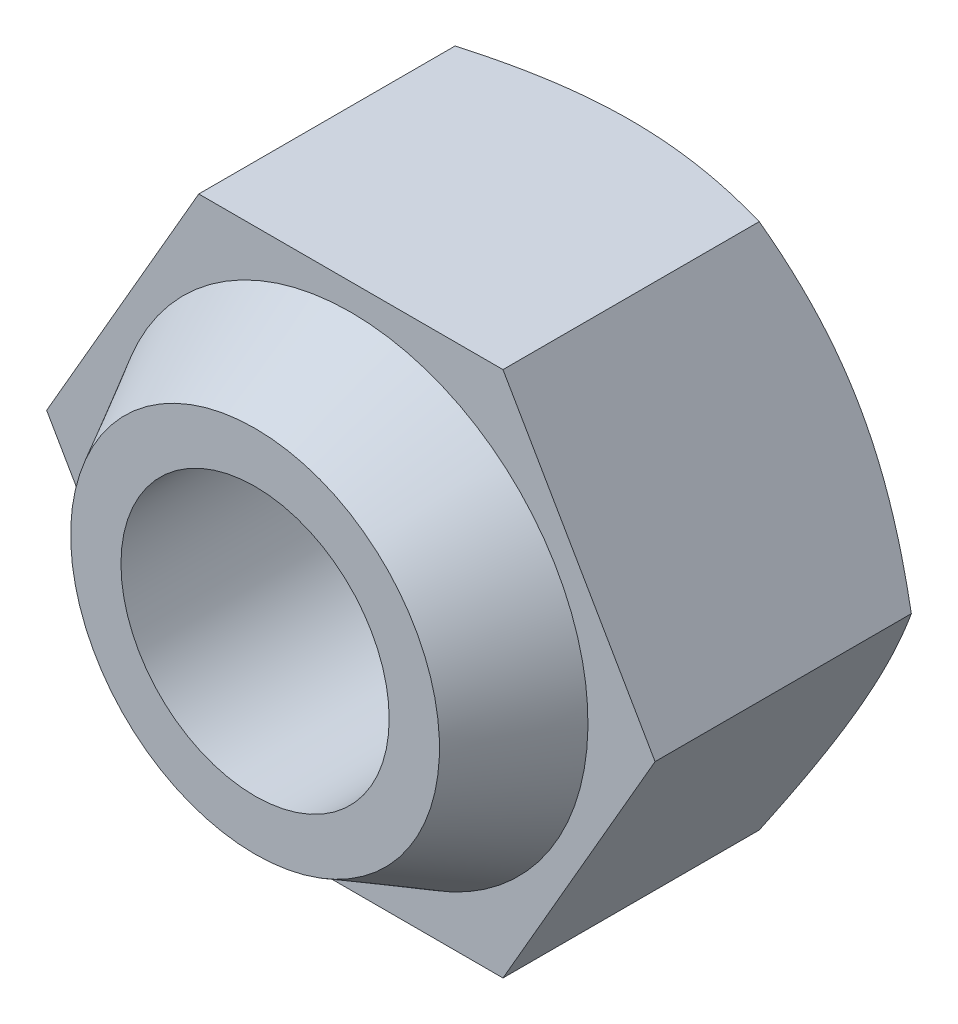
ISO-10303-21;
HEADER;
FILE_DESCRIPTION(('STEP AP214'),'2;1');
FILE_NAME('part.step','',(''),(''),'','','');
FILE_SCHEMA(('AUTOMOTIVE_DESIGN { 1 0 10303 214 1 1 1 1 }'));
ENDSEC;
DATA;
#1=APPLICATION_CONTEXT('core data for automotive mechanical design processes');
#2=APPLICATION_PROTOCOL_DEFINITION('international standard','automotive_design',2000,#1);
#3=PRODUCT_CONTEXT('',#1,'mechanical');
#4=PRODUCT('Part','Part','',(#3));
#5=PRODUCT_RELATED_PRODUCT_CATEGORY('part','',(#4));
#6=PRODUCT_DEFINITION_FORMATION('','',#4);
#7=PRODUCT_DEFINITION_CONTEXT('part definition',#1,'design');
#8=PRODUCT_DEFINITION('design','',#6,#7);
#9=PRODUCT_DEFINITION_SHAPE('','',#8);
#10=(LENGTH_UNIT() NAMED_UNIT(*) SI_UNIT(.MILLI.,.METRE.));
#11=(NAMED_UNIT(*) PLANE_ANGLE_UNIT() SI_UNIT($,.RADIAN.));
#12=(NAMED_UNIT(*) SI_UNIT($,.STERADIAN.) SOLID_ANGLE_UNIT());
#13=UNCERTAINTY_MEASURE_WITH_UNIT(LENGTH_MEASURE(1.E-05),#10,'distance_accuracy_value','');
#14=(GEOMETRIC_REPRESENTATION_CONTEXT(3) GLOBAL_UNCERTAINTY_ASSIGNED_CONTEXT((#13)) GLOBAL_UNIT_ASSIGNED_CONTEXT((#10,
#11,#12)) REPRESENTATION_CONTEXT('',''));
#15=CARTESIAN_POINT('',(0.,0.,0.));
#16=DIRECTION('',(0.,0.,1.));
#17=DIRECTION('',(1.,0.,0.));
#18=AXIS2_PLACEMENT_3D('',#15,#16,#17);
#19=CARTESIAN_POINT('',(1.58771324027147,-2.75,3.));
#20=DIRECTION('',(-0.866025403784439,0.5,0.));
#21=DIRECTION('',(-0.5,-0.866025403784439,0.));
#22=AXIS2_PLACEMENT_3D('',#19,#20,#21);
#23=PLANE('',#22);
#24=CARTESIAN_POINT('',(3.17554195059678,0.0002,0.325072425378332));
#25=CARTESIAN_POINT('',(3.10576962051743,-0.120649220659906,0.284773324262835));
#26=CARTESIAN_POINT('',(3.03539502097908,-0.242541602622634,0.248122564611234));
#27=CARTESIAN_POINT('',(2.89342717394439,-0.488437126727892,0.184147844983373));
#28=CARTESIAN_POINT('',(2.82183140359858,-0.612444638573855,0.15684651768807));
#29=CARTESIAN_POINT('',(2.67952717191842,-0.858922797975944,0.114347407307689));
#30=CARTESIAN_POINT('',(2.60884060771577,-0.981355518587417,0.0988667806360302));
#31=CARTESIAN_POINT('',(2.46713482015518,-1.22679714236892,0.080385059383513));
#32=CARTESIAN_POINT('',(2.39611611197038,-1.34980515323291,0.0773686614761725));
#33=CARTESIAN_POINT('',(2.26341005486544,-1.57965878661079,0.0836388074421195));
#34=CARTESIAN_POINT('',(2.20170285541369,-1.68653879125402,0.0913858162902751));
#35=CARTESIAN_POINT('',(2.07869048467395,-1.89960246733475,0.115940843077927));
#36=CARTESIAN_POINT('',(2.01738573896433,-2.00578540164889,0.132757251664143));
#37=CARTESIAN_POINT('',(1.89411967378235,-2.21928848939318,0.174797584359529));
#38=CARTESIAN_POINT('',(1.83217395817123,-2.32658161614285,0.200199742700803));
#39=CARTESIAN_POINT('',(1.70920651275307,-2.53956747928405,0.257852887853554));
#40=CARTESIAN_POINT('',(1.64818320715446,-2.64526294502665,0.290090325312555));
#41=CARTESIAN_POINT('',(1.58759777021763,-2.7502,0.325072425378332));
#42=B_SPLINE_CURVE_WITH_KNOTS('',3,(#24,#25,#26,#27,#28,#29,#30,#31,#32,#33,#34,#35,#36,#37,#38,
#39,#40,#41),.UNSPECIFIED.,.F.,.F.,(4,2,2,2,2,2,2,2,4),(0.,0.435912828725888,0.872873557116332,
1.29901931904672,1.72464171213574,2.09526089052938,2.46622354066374,2.84541551798557,
3.22386274754524),.UNSPECIFIED.);
#43=CARTESIAN_POINT('',(3.17542648054294,0.,0.325005755075434));
#44=VERTEX_POINT('',#43);
#45=CARTESIAN_POINT('',(1.58771324027147,-2.75,0.325005755075434));
#46=VERTEX_POINT('',#45);
#47=EDGE_CURVE('E59',#44,#46,#42,.T.);
#48=ORIENTED_EDGE('',*,*,#47,.F.);
#49=DIRECTION('',(0.,0.,-1.));
#50=VECTOR('',#49,1.);
#51=CARTESIAN_POINT('',(3.17542648054294,0.,3.));
#52=LINE('',#51,#50);
#53=CARTESIAN_POINT('',(3.17542648054294,0.,3.));
#54=VERTEX_POINT('',#53);
#55=EDGE_CURVE('E52',#54,#44,#52,.T.);
#56=ORIENTED_EDGE('',*,*,#55,.F.);
#57=DIRECTION('',(0.5,0.866025403784439,0.));
#58=VECTOR('',#57,1.);
#59=CARTESIAN_POINT('',(1.58771324027147,-2.75,3.));
#60=LINE('',#59,#58);
#61=CARTESIAN_POINT('',(1.58771324027147,-2.75,3.));
#62=VERTEX_POINT('',#61);
#63=EDGE_CURVE('E332',#62,#54,#60,.T.);
#64=ORIENTED_EDGE('',*,*,#63,.F.);
#65=DIRECTION('',(0.,0.,-1.));
#66=VECTOR('',#65,1.);
#67=CARTESIAN_POINT('',(1.58771324027147,-2.75,3.));
#68=LINE('',#67,#66);
#69=EDGE_CURVE('E110',#62,#46,#68,.T.);
#70=ORIENTED_EDGE('',*,*,#69,.T.);
#71=EDGE_LOOP('',(#48,#56,#64,#70));
#72=FACE_BOUND('',#71,.T.);
#73=ADVANCED_FACE('F43',(#72),#23,.F.);
#74=CARTESIAN_POINT('',(3.17542648054294,0.,3.));
#75=DIRECTION('',(-0.866025403784439,-0.5,0.));
#76=DIRECTION('',(0.,0.,1.));
#77=AXIS2_PLACEMENT_3D('',#74,#75,#76);
#78=PLANE('',#77);
#79=CARTESIAN_POINT('',(1.58759777021763,2.7502,0.325072425378332));
#80=CARTESIAN_POINT('',(1.65737010029699,2.62935077934009,0.284773324262835));
#81=CARTESIAN_POINT('',(1.72774469983533,2.50745839737737,0.248122564611234));
#82=CARTESIAN_POINT('',(1.86971254687003,2.26156287327211,0.184147844983373));
#83=CARTESIAN_POINT('',(1.94130831721583,2.13755536142614,0.15684651768807));
#84=CARTESIAN_POINT('',(2.08361254889599,1.89107720202406,0.11434740730769));
#85=CARTESIAN_POINT('',(2.15429911309864,1.76864448141258,0.0988667806360306));
#86=CARTESIAN_POINT('',(2.29600490065923,1.52320285763108,0.0803850593835131));
#87=CARTESIAN_POINT('',(2.36702360884404,1.40019484676709,0.0773686614761723));
#88=CARTESIAN_POINT('',(2.49972966594897,1.17034121338921,0.0836388074421193));
#89=CARTESIAN_POINT('',(2.56143686540073,1.06346120874598,0.0913858162902751));
#90=CARTESIAN_POINT('',(2.68444923614047,0.85039753266525,0.115940843077927));
#91=CARTESIAN_POINT('',(2.74575398185008,0.744214598351111,0.132757251664143));
#92=CARTESIAN_POINT('',(2.86902004703206,0.530711510606816,0.174797584359529));
#93=CARTESIAN_POINT('',(2.93096576264318,0.423418383857145,0.200199742700803));
#94=CARTESIAN_POINT('',(3.05393320806134,0.210432520715949,0.257852887853554));
#95=CARTESIAN_POINT('',(3.11495651365995,0.104737054973347,0.290090325312554));
#96=CARTESIAN_POINT('',(3.17554195059678,-0.000199999999999999,0.325072425378332));
#97=B_SPLINE_CURVE_WITH_KNOTS('',3,(#79,#80,#81,#82,#83,#84,#85,#86,#87,#88,#89,#90,#91,#92,#93,
#94,#95,#96),.UNSPECIFIED.,.F.,.F.,(4,2,2,2,2,2,2,2,4),(0.,0.435912828725888,0.872873557116332,
1.29901931904672,1.72464171213574,2.09526089052938,2.46622354066374,2.84541551798557,
3.22386274754524),.UNSPECIFIED.);
#98=CARTESIAN_POINT('',(1.58771324027147,2.75,0.325005755075434));
#99=VERTEX_POINT('',#98);
#100=EDGE_CURVE('E66',#99,#44,#97,.T.);
#101=ORIENTED_EDGE('',*,*,#100,.F.);
#102=DIRECTION('',(0.,0.,-1.));
#103=VECTOR('',#102,1.);
#104=CARTESIAN_POINT('',(1.58771324027147,2.75,3.));
#105=LINE('',#104,#103);
#106=CARTESIAN_POINT('',(1.58771324027147,2.75,3.));
#107=VERTEX_POINT('',#106);
#108=EDGE_CURVE('E334',#107,#99,#105,.T.);
#109=ORIENTED_EDGE('',*,*,#108,.F.);
#110=DIRECTION('',(-0.5,0.866025403784439,0.));
#111=VECTOR('',#110,1.);
#112=CARTESIAN_POINT('',(3.17542648054294,0.,3.));
#113=LINE('',#112,#111);
#114=EDGE_CURVE('E333',#54,#107,#113,.T.);
#115=ORIENTED_EDGE('',*,*,#114,.F.);
#116=ORIENTED_EDGE('',*,*,#55,.T.);
#117=EDGE_LOOP('',(#101,#109,#115,#116));
#118=FACE_BOUND('',#117,.T.);
#119=ADVANCED_FACE('F179',(#118),#78,.F.);
#120=CARTESIAN_POINT('',(1.58771324027147,2.75,3.));
#121=DIRECTION('',(0.,-1.,0.));
#122=DIRECTION('',(1.,0.,0.));
#123=AXIS2_PLACEMENT_3D('',#120,#121,#122);
#124=PLANE('',#123);
#125=CARTESIAN_POINT('',(-4.82209591409801,2.75,1.69662218758662));
#126=CARTESIAN_POINT('',(-4.70698459391359,2.75,1.63889978333482));
#127=CARTESIAN_POINT('',(-4.59167523097896,2.75,1.58156823824504));
#128=CARTESIAN_POINT('',(-4.36057376347925,2.75,1.46787810056609));
#129=CARTESIAN_POINT('',(-4.24478164413152,2.75,1.4115195380467));
#130=CARTESIAN_POINT('',(-4.01240519378638,2.75,1.29985971222661));
#131=CARTESIAN_POINT('',(-3.89581974792902,2.75,1.24456076421826));
#132=CARTESIAN_POINT('',(-3.66197617100479,2.75,1.13539657081718));
#133=CARTESIAN_POINT('',(-3.54471802983216,2.75,1.08153134703193));
#134=CARTESIAN_POINT('',(-3.30402977097251,2.75,0.97314911140013));
#135=CARTESIAN_POINT('',(-3.18056234581917,2.75,0.918714677644328));
#136=CARTESIAN_POINT('',(-2.93258356998985,2.75,0.812280566752799));
#137=CARTESIAN_POINT('',(-2.80807225529914,2.75,0.760280806091854));
#138=CARTESIAN_POINT('',(-2.55789086770319,2.75,0.659412394645464));
#139=CARTESIAN_POINT('',(-2.43222175656898,2.75,0.61054137344382));
#140=CARTESIAN_POINT('',(-2.17937205899324,2.75,0.516746741866131));
#141=CARTESIAN_POINT('',(-2.05219106628962,2.75,0.471824221027261));
#142=CARTESIAN_POINT('',(-1.76687012212301,2.75,0.377381666854391));
#143=CARTESIAN_POINT('',(-1.60829414480962,2.75,0.329155252936632));
#144=CARTESIAN_POINT('',(-1.28838166324069,2.75,0.243095212306075));
#145=CARTESIAN_POINT('',(-1.12704682552895,2.75,0.205255531555934));
#146=CARTESIAN_POINT('',(-0.804469695356102,2.75,0.143637655205873));
#147=CARTESIAN_POINT('',(-0.643272285950552,2.75,0.119631751830708));
#148=CARTESIAN_POINT('',(-0.31931604284421,2.75,0.0874053958225153));
#149=CARTESIAN_POINT('',(-0.156557934169368,2.75,0.07917793940605));
#150=CARTESIAN_POINT('',(0.170007651387071,2.75,0.0796028206733509));
#151=CARTESIAN_POINT('',(0.333814985979489,2.75,0.0883665881586944));
#152=CARTESIAN_POINT('',(0.65980645261474,2.75,0.121807632000603));
#153=CARTESIAN_POINT('',(0.821989792484146,2.75,0.146492323844561));
#154=CARTESIAN_POINT('',(1.14650984692983,2.75,0.20953600114308));
#155=CARTESIAN_POINT('',(1.30880056937427,2.75,0.248124412024964));
#156=CARTESIAN_POINT('',(1.63059177563563,2.75,0.335684628702225));
#157=CARTESIAN_POINT('',(1.79009058143429,2.75,0.384662461535137));
#158=CARTESIAN_POINT('',(2.07517756341798,2.75,0.47981769857197));
#159=CARTESIAN_POINT('',(2.20122944462247,2.75,0.524630817745627));
#160=CARTESIAN_POINT('',(2.45185743761155,2.75,0.618089681394542));
#161=CARTESIAN_POINT('',(2.57643394999465,2.75,0.666734356726972));
#162=CARTESIAN_POINT('',(2.82445462314632,2.75,0.767063549197108));
#163=CARTESIAN_POINT('',(2.94789789477543,2.75,0.818750250764966));
#164=CARTESIAN_POINT('',(3.19376461702501,2.75,0.924497197071317));
#165=CARTESIAN_POINT('',(3.31618803411527,2.75,0.978557519484863));
#166=CARTESIAN_POINT('',(3.55488294596269,2.75,1.08617837731915));
#167=CARTESIAN_POINT('',(3.67119073372333,2.75,1.13965867593344));
#168=CARTESIAN_POINT('',(3.90314682486717,2.75,1.24802360616247));
#169=CARTESIAN_POINT('',(4.01879513854485,2.75,1.30290821578193));
#170=CARTESIAN_POINT('',(4.2493210301962,2.75,1.41372378832857));
#171=CARTESIAN_POINT('',(4.36419964743295,2.75,1.46965259375076));
#172=CARTESIAN_POINT('',(4.59348248513187,2.75,1.58246667802543));
#173=CARTESIAN_POINT('',(4.70788671915892,2.75,1.63935192929018));
#174=CARTESIAN_POINT('',(4.82209591409801,2.75,1.69662218758662));
#175=B_SPLINE_CURVE_WITH_KNOTS('',3,(#125,#126,#127,#128,#129,#130,#131,#132,#133,#134,#135,
#136,#137,#138,#139,#140,#141,#142,#143,#144,#145,#146,#147,#148,#149,#150,#151,#152,#153,#154,
#155,#156,#157,#158,#159,#160,#161,#162,#163,#164,#165,#166,#167,#168,#169,#170,#171,#172,#173,
#174),.UNSPECIFIED.,.F.,.F.,(4,2,2,2,2,2,2,2,2,2,2,2,2,2,2,2,2,2,2,2,2,2,2,2,4),(0.,
0.386321056941321,0.772654031738451,1.15975221487635,1.5468562286242,1.95163891266918,
2.35640769982902,2.7608661028432,3.16543576278735,3.66241517708883,4.15910430264312,
4.64736533375746,5.13540958392009,5.62666529559508,6.11814998479502,6.61814686810423,
7.11843460318229,7.51970628823735,7.92086639795479,8.32231817475425,8.72378309858282,
9.10781470943075,9.49184030899168,9.87514505132587,10.2584387565117),.UNSPECIFIED.);
#176=CARTESIAN_POINT('',(-1.58771324027147,2.75,0.325005755075434));
#177=VERTEX_POINT('',#176);
#178=EDGE_CURVE('E163',#177,#99,#175,.T.);
#179=ORIENTED_EDGE('',*,*,#178,.F.);
#180=DIRECTION('',(0.,0.,-1.));
#181=VECTOR('',#180,1.);
#182=CARTESIAN_POINT('',(-1.58771324027147,2.75,3.));
#183=LINE('',#182,#181);
#184=CARTESIAN_POINT('',(-1.58771324027147,2.75,3.));
#185=VERTEX_POINT('',#184);
#186=EDGE_CURVE('E336',#185,#177,#183,.T.);
#187=ORIENTED_EDGE('',*,*,#186,.F.);
#188=DIRECTION('',(-1.,0.,0.));
#189=VECTOR('',#188,1.);
#190=CARTESIAN_POINT('',(1.58771324027147,2.75,3.));
#191=LINE('',#190,#189);
#192=EDGE_CURVE('E348',#107,#185,#191,.T.);
#193=ORIENTED_EDGE('',*,*,#192,.F.);
#194=ORIENTED_EDGE('',*,*,#108,.T.);
#195=EDGE_LOOP('',(#179,#187,#193,#194));
#196=FACE_BOUND('',#195,.T.);
#197=ADVANCED_FACE('F182',(#196),#124,.F.);
#198=CARTESIAN_POINT('',(-1.58771324027147,2.75,3.));
#199=DIRECTION('',(0.866025403784439,-0.500000000000001,0.));
#200=DIRECTION('',(0.500000000000001,0.866025403784439,0.));
#201=AXIS2_PLACEMENT_3D('',#198,#199,#200);
#202=PLANE('',#201);
#203=CARTESIAN_POINT('',(-3.17554195059678,-0.000199999999999133,0.325072425378333));
#204=CARTESIAN_POINT('',(-3.10576962051743,0.120649220659907,0.284773324262836));
#205=CARTESIAN_POINT('',(-3.03539502097908,0.242541602622635,0.248122564611235));
#206=CARTESIAN_POINT('',(-2.89342717394439,0.488437126727894,0.184147844983374));
#207=CARTESIAN_POINT('',(-2.82183140359858,0.612444638573856,0.15684651768807));
#208=CARTESIAN_POINT('',(-2.67952717191842,0.858922797975944,0.11434740730769));
#209=CARTESIAN_POINT('',(-2.60884060771577,0.981355518587418,0.0988667806360308));
#210=CARTESIAN_POINT('',(-2.46713482015519,1.22679714236892,0.0803850593835135));
#211=CARTESIAN_POINT('',(-2.39611611197038,1.34980515323291,0.0773686614761728));
#212=CARTESIAN_POINT('',(-2.26341005486544,1.57965878661079,0.0836388074421197));
#213=CARTESIAN_POINT('',(-2.20170285541369,1.68653879125402,0.0913858162902754));
#214=CARTESIAN_POINT('',(-2.07869048467395,1.89960246733475,0.115940843077928));
#215=CARTESIAN_POINT('',(-2.01738573896433,2.00578540164889,0.132757251664143));
#216=CARTESIAN_POINT('',(-1.89411967378235,2.21928848939318,0.174797584359529));
#217=CARTESIAN_POINT('',(-1.83217395817123,2.32658161614286,0.200199742700803));
#218=CARTESIAN_POINT('',(-1.70920651275307,2.53956747928405,0.257852887853554));
#219=CARTESIAN_POINT('',(-1.64818320715446,2.64526294502665,0.290090325312554));
#220=CARTESIAN_POINT('',(-1.58759777021763,2.7502,0.325072425378332));
#221=B_SPLINE_CURVE_WITH_KNOTS('',3,(#203,#204,#205,#206,#207,#208,#209,#210,#211,#212,#213,
#214,#215,#216,#217,#218,#219,#220),.UNSPECIFIED.,.F.,.F.,(4,2,2,2,2,2,2,2,4),(0.,
0.435912828725889,0.872873557116333,1.29901931904672,1.72464171213574,2.09526089052938,
2.46622354066374,2.84541551798557,3.22386274754524),.UNSPECIFIED.);
#222=CARTESIAN_POINT('',(-3.17542648054294,0.,0.325005755075435));
#223=VERTEX_POINT('',#222);
#224=EDGE_CURVE('E119',#223,#177,#221,.T.);
#225=ORIENTED_EDGE('',*,*,#224,.F.);
#226=DIRECTION('',(0.,0.,-1.));
#227=VECTOR('',#226,1.);
#228=CARTESIAN_POINT('',(-3.17542648054294,0.,3.));
#229=LINE('',#228,#227);
#230=CARTESIAN_POINT('',(-3.17542648054294,0.,3.));
#231=VERTEX_POINT('',#230);
#232=EDGE_CURVE('E109',#231,#223,#229,.T.);
#233=ORIENTED_EDGE('',*,*,#232,.F.);
#234=DIRECTION('',(-0.500000000000001,-0.866025403784438,0.));
#235=VECTOR('',#234,1.);
#236=CARTESIAN_POINT('',(-1.58771324027147,2.75,3.));
#237=LINE('',#236,#235);
#238=EDGE_CURVE('E346',#185,#231,#237,.T.);
#239=ORIENTED_EDGE('',*,*,#238,.F.);
#240=ORIENTED_EDGE('',*,*,#186,.T.);
#241=EDGE_LOOP('',(#225,#233,#239,#240));
#242=FACE_BOUND('',#241,.T.);
#243=ADVANCED_FACE('F185',(#242),#202,.F.);
#244=CARTESIAN_POINT('',(-3.17542648054294,0.,3.));
#245=DIRECTION('',(0.866025403784439,0.5,0.));
#246=DIRECTION('',(0.,0.,-1.));
#247=AXIS2_PLACEMENT_3D('',#244,#245,#246);
#248=PLANE('',#247);
#249=CARTESIAN_POINT('',(-1.58759777021763,-2.7502,0.325072425378333));
#250=CARTESIAN_POINT('',(-1.65737010029699,-2.62935077934009,0.284773324262836));
#251=CARTESIAN_POINT('',(-1.72774469983533,-2.50745839737736,0.248122564611235));
#252=CARTESIAN_POINT('',(-1.86971254687003,-2.26156287327211,0.184147844983374));
#253=CARTESIAN_POINT('',(-1.94130831721583,-2.13755536142614,0.15684651768807));
#254=CARTESIAN_POINT('',(-2.08361254889599,-1.89107720202405,0.11434740730769));
#255=CARTESIAN_POINT('',(-2.15429911309864,-1.76864448141258,0.0988667806360312));
#256=CARTESIAN_POINT('',(-2.29600490065923,-1.52320285763108,0.0803850593835139));
#257=CARTESIAN_POINT('',(-2.36702360884404,-1.40019484676709,0.0773686614761732));
#258=CARTESIAN_POINT('',(-2.49972966594897,-1.17034121338921,0.0836388074421203));
#259=CARTESIAN_POINT('',(-2.56143686540073,-1.06346120874598,0.091385816290276));
#260=CARTESIAN_POINT('',(-2.68444923614047,-0.850397532665249,0.115940843077928));
#261=CARTESIAN_POINT('',(-2.74575398185008,-0.744214598351109,0.132757251664144));
#262=CARTESIAN_POINT('',(-2.86902004703207,-0.530711510606815,0.17479758435953));
#263=CARTESIAN_POINT('',(-2.93096576264318,-0.423418383857143,0.200199742700804));
#264=CARTESIAN_POINT('',(-3.05393320806134,-0.210432520715948,0.257852887853555));
#265=CARTESIAN_POINT('',(-3.11495651365995,-0.104737054973347,0.290090325312556));
#266=CARTESIAN_POINT('',(-3.17554195059678,0.000200000000000823,0.325072425378333));
#267=B_SPLINE_CURVE_WITH_KNOTS('',3,(#249,#250,#251,#252,#253,#254,#255,#256,#257,#258,#259,
#260,#261,#262,#263,#264,#265,#266),.UNSPECIFIED.,.F.,.F.,(4,2,2,2,2,2,2,2,4),(0.,
0.435912828725889,0.872873557116332,1.29901931904672,1.72464171213574,2.09526089052938,
2.46622354066374,2.84541551798557,3.22386274754524),.UNSPECIFIED.);
#268=CARTESIAN_POINT('',(-1.58771324027179,-2.75,0.32500575507525));
#269=VERTEX_POINT('',#268);
#270=EDGE_CURVE('E114',#269,#223,#267,.T.);
#271=ORIENTED_EDGE('',*,*,#270,.F.);
#272=DIRECTION('',(0.,0.,-1.));
#273=VECTOR('',#272,1.);
#274=CARTESIAN_POINT('',(-1.58771324027147,-2.75,3.));
#275=LINE('',#274,#273);
#276=CARTESIAN_POINT('',(-1.58771324027147,-2.75,3.));
#277=VERTEX_POINT('',#276);
#278=EDGE_CURVE('E100',#277,#269,#275,.T.);
#279=ORIENTED_EDGE('',*,*,#278,.F.);
#280=DIRECTION('',(0.5,-0.866025403784439,0.));
#281=VECTOR('',#280,1.);
#282=CARTESIAN_POINT('',(-3.17542648054294,0.,3.));
#283=LINE('',#282,#281);
#284=EDGE_CURVE('E344',#231,#277,#283,.T.);
#285=ORIENTED_EDGE('',*,*,#284,.F.);
#286=ORIENTED_EDGE('',*,*,#232,.T.);
#287=EDGE_LOOP('',(#271,#279,#285,#286));
#288=FACE_BOUND('',#287,.T.);
#289=ADVANCED_FACE('F115',(#288),#248,.F.);
#290=CARTESIAN_POINT('',(-1.58771324027147,-2.75,3.));
#291=DIRECTION('',(0.,1.,0.));
#292=DIRECTION('',(-1.,0.,0.));
#293=AXIS2_PLACEMENT_3D('',#290,#291,#292);
#294=PLANE('',#293);
#295=CARTESIAN_POINT('',(4.82209591409801,-2.75,1.69662218758663));
#296=CARTESIAN_POINT('',(4.70698459391359,-2.75,1.63889978333482));
#297=CARTESIAN_POINT('',(4.59167523097896,-2.75,1.58156823824504));
#298=CARTESIAN_POINT('',(4.36057376347925,-2.75,1.46787810056609));
#299=CARTESIAN_POINT('',(4.24478164413152,-2.75,1.4115195380467));
#300=CARTESIAN_POINT('',(4.01240519378639,-2.75,1.29985971222662));
#301=CARTESIAN_POINT('',(3.89581974792902,-2.75,1.24456076421826));
#302=CARTESIAN_POINT('',(3.66197617100479,-2.75,1.13539657081718));
#303=CARTESIAN_POINT('',(3.54471802983216,-2.75,1.08153134703193));
#304=CARTESIAN_POINT('',(3.30402977097251,-2.75,0.973149111400131));
#305=CARTESIAN_POINT('',(3.18056234581917,-2.75,0.918714677644329));
#306=CARTESIAN_POINT('',(2.93258356998985,-2.75,0.8122805667528));
#307=CARTESIAN_POINT('',(2.80807225529914,-2.75,0.760280806091854));
#308=CARTESIAN_POINT('',(2.55789086770319,-2.75,0.659412394645465));
#309=CARTESIAN_POINT('',(2.43222175656898,-2.75,0.61054137344382));
#310=CARTESIAN_POINT('',(2.17937205899324,-2.75,0.516746741866131));
#311=CARTESIAN_POINT('',(2.05219106628962,-2.75,0.471824221027262));
#312=CARTESIAN_POINT('',(1.76687012212302,-2.75,0.377381666854392));
#313=CARTESIAN_POINT('',(1.60829414480963,-2.75,0.329155252936632));
#314=CARTESIAN_POINT('',(1.28838166324069,-2.75,0.243095212306075));
#315=CARTESIAN_POINT('',(1.12704682552895,-2.75,0.205255531555934));
#316=CARTESIAN_POINT('',(0.804469695356104,-2.75,0.143637655205873));
#317=CARTESIAN_POINT('',(0.643272285950553,-2.75,0.119631751830708));
#318=CARTESIAN_POINT('',(0.319316042844211,-2.75,0.0874053958225154));
#319=CARTESIAN_POINT('',(0.15655793416937,-2.75,0.07917793940605));
#320=CARTESIAN_POINT('',(-0.170007651387069,-2.75,0.0796028206733506));
#321=CARTESIAN_POINT('',(-0.333814985979488,-2.75,0.0883665881586939));
#322=CARTESIAN_POINT('',(-0.659806452614739,-2.75,0.121807632000603));
#323=CARTESIAN_POINT('',(-0.821989792484144,-2.75,0.14649232384456));
#324=CARTESIAN_POINT('',(-1.14650984692983,-2.75,0.20953600114308));
#325=CARTESIAN_POINT('',(-1.30880056937426,-2.75,0.248124412024963));
#326=CARTESIAN_POINT('',(-1.63059177563562,-2.75,0.335684628702224));
#327=CARTESIAN_POINT('',(-1.79009058143429,-2.75,0.384662461535136));
#328=CARTESIAN_POINT('',(-2.07517756341798,-2.75,0.479817698571969));
#329=CARTESIAN_POINT('',(-2.20122944462247,-2.75,0.524630817745626));
#330=CARTESIAN_POINT('',(-2.45185743761155,-2.75,0.618089681394542));
#331=CARTESIAN_POINT('',(-2.57643394999465,-2.75,0.666734356726972));
#332=CARTESIAN_POINT('',(-2.82445462314632,-2.75,0.767063549197108));
#333=CARTESIAN_POINT('',(-2.94789789477543,-2.75,0.818750250764965));
#334=CARTESIAN_POINT('',(-3.19376461702501,-2.75,0.924497197071317));
#335=CARTESIAN_POINT('',(-3.31618803411527,-2.75,0.978557519484863));
#336=CARTESIAN_POINT('',(-3.55488294596269,-2.75,1.08617837731915));
#337=CARTESIAN_POINT('',(-3.67119073372333,-2.75,1.13965867593344));
#338=CARTESIAN_POINT('',(-3.90314682486718,-2.75,1.24802360616247));
#339=CARTESIAN_POINT('',(-4.01879513854485,-2.75,1.30290821578193));
#340=CARTESIAN_POINT('',(-4.2493210301962,-2.75,1.41372378832858));
#341=CARTESIAN_POINT('',(-4.36419964743295,-2.75,1.46965259375076));
#342=CARTESIAN_POINT('',(-4.59348248513188,-2.75,1.58246667802544));
#343=CARTESIAN_POINT('',(-4.70788671915892,-2.75,1.63935192929018));
#344=CARTESIAN_POINT('',(-4.82209591409802,-2.75,1.69662218758663));
#345=B_SPLINE_CURVE_WITH_KNOTS('',3,(#295,#296,#297,#298,#299,#300,#301,#302,#303,#304,#305,
#306,#307,#308,#309,#310,#311,#312,#313,#314,#315,#316,#317,#318,#319,#320,#321,#322,#323,#324,
#325,#326,#327,#328,#329,#330,#331,#332,#333,#334,#335,#336,#337,#338,#339,#340,#341,#342,#343,
#344),.UNSPECIFIED.,.F.,.F.,(4,2,2,2,2,2,2,2,2,2,2,2,2,2,2,2,2,2,2,2,2,2,2,2,4),(0.,
0.38632105694132,0.772654031738451,1.15975221487635,1.5468562286242,1.95163891266918,
2.35640769982902,2.7608661028432,3.16543576278735,3.66241517708883,4.15910430264312,
4.64736533375746,5.13540958392009,5.62666529559508,6.11814998479502,6.61814686810423,
7.11843460318229,7.51970628823735,7.92086639795479,8.32231817475426,8.72378309858282,
9.10781470943075,9.49184030899168,9.87514505132588,10.2584387565117),.UNSPECIFIED.);
#346=EDGE_CURVE('E105',#46,#269,#345,.T.);
#347=ORIENTED_EDGE('',*,*,#346,.F.);
#348=ORIENTED_EDGE('',*,*,#69,.F.);
#349=DIRECTION('',(1.,0.,0.));
#350=VECTOR('',#349,1.);
#351=CARTESIAN_POINT('',(-1.58771324027147,-2.75,3.));
#352=LINE('',#351,#350);
#353=EDGE_CURVE('E106',#277,#62,#352,.T.);
#354=ORIENTED_EDGE('',*,*,#353,.F.);
#355=ORIENTED_EDGE('',*,*,#278,.T.);
#356=EDGE_LOOP('',(#347,#348,#354,#355));
#357=FACE_BOUND('',#356,.T.);
#358=ADVANCED_FACE('F102',(#357),#294,.F.);
#359=CARTESIAN_POINT('',(3.17542648054294,0.,3.));
#360=DIRECTION('',(0.,0.,1.));
#361=DIRECTION('',(-0.5,0.866025403784439,0.));
#362=AXIS2_PLACEMENT_3D('',#359,#360,#361);
#363=PLANE('',#362);
#364=CARTESIAN_POINT('',(0.,0.,3.));
#365=DIRECTION('',(0.,0.,-1.));
#366=DIRECTION('',(0.,1.,0.));
#367=AXIS2_PLACEMENT_3D('',#364,#365,#366);
#368=CIRCLE('',#367,2.475);
#369=CARTESIAN_POINT('',(0.,2.475,3.));
#370=VERTEX_POINT('',#369);
#371=EDGE_CURVE('E122',#370,#370,#368,.T.);
#372=ORIENTED_EDGE('',*,*,#371,.T.);
#373=EDGE_LOOP('',(#372));
#374=FACE_BOUND('',#373,.T.);
#375=ORIENTED_EDGE('',*,*,#63,.T.);
#376=ORIENTED_EDGE('',*,*,#114,.T.);
#377=ORIENTED_EDGE('',*,*,#192,.T.);
#378=ORIENTED_EDGE('',*,*,#238,.T.);
#379=ORIENTED_EDGE('',*,*,#284,.T.);
#380=ORIENTED_EDGE('',*,*,#353,.T.);
#381=EDGE_LOOP('',(#375,#376,#377,#378,#379,#380));
#382=FACE_BOUND('',#381,.T.);
#383=ADVANCED_FACE('F147',(#374,#382),#363,.T.);
#384=CARTESIAN_POINT('',(0.,0.,0.));
#385=DIRECTION('',(0.,0.,1.));
#386=DIRECTION('',(0.,-1.,0.));
#387=AXIS2_PLACEMENT_3D('',#384,#385,#386);
#388=CONICAL_SURFACE('',#387,2.6125,1.0471975511966);
#389=CARTESIAN_POINT('',(0.,0.,0.));
#390=DIRECTION('',(0.,0.,1.));
#391=DIRECTION('',(1.,0.,0.));
#392=AXIS2_PLACEMENT_3D('',#389,#390,#391);
#393=CIRCLE('',#392,2.6125);
#394=CARTESIAN_POINT('',(2.6125,0.,0.));
#395=VERTEX_POINT('',#394);
#396=EDGE_CURVE('E11',#395,#395,#393,.T.);
#397=ORIENTED_EDGE('',*,*,#396,.T.);
#398=EDGE_LOOP('',(#397));
#399=FACE_BOUND('',#398,.T.);
#400=ORIENTED_EDGE('',*,*,#100,.T.);
#401=ORIENTED_EDGE('',*,*,#47,.T.);
#402=ORIENTED_EDGE('',*,*,#346,.T.);
#403=ORIENTED_EDGE('',*,*,#270,.T.);
#404=ORIENTED_EDGE('',*,*,#224,.T.);
#405=ORIENTED_EDGE('',*,*,#178,.T.);
#406=EDGE_LOOP('',(#400,#401,#402,#403,#404,#405));
#407=FACE_BOUND('',#406,.T.);
#408=ADVANCED_FACE('F121',(#399,#407),#388,.T.);
#409=CARTESIAN_POINT('',(3.17542648054294,0.,0.));
#410=DIRECTION('',(0.,0.,1.));
#411=DIRECTION('',(-0.5,0.866025403784439,0.));
#412=AXIS2_PLACEMENT_3D('',#409,#410,#411);
#413=PLANE('',#412);
#414=CARTESIAN_POINT('',(0.,0.,0.));
#415=DIRECTION('',(0.,0.,1.));
#416=DIRECTION('',(1.,0.,0.));
#417=AXIS2_PLACEMENT_3D('',#414,#415,#416);
#418=CIRCLE('',#417,1.4);
#419=CARTESIAN_POINT('',(1.4,0.,0.));
#420=VERTEX_POINT('',#419);
#421=EDGE_CURVE('E322',#420,#420,#418,.F.);
#422=ORIENTED_EDGE('',*,*,#421,.F.);
#423=EDGE_LOOP('',(#422));
#424=FACE_BOUND('',#423,.T.);
#425=ORIENTED_EDGE('',*,*,#396,.F.);
#426=EDGE_LOOP('',(#425));
#427=FACE_BOUND('',#426,.T.);
#428=ADVANCED_FACE('F146',(#424,#427),#413,.F.);
#429=CARTESIAN_POINT('',(0.,0.,3.));
#430=DIRECTION('',(0.,0.,-1.));
#431=DIRECTION('',(0.,1.,0.));
#432=AXIS2_PLACEMENT_3D('',#429,#430,#431);
#433=CONICAL_SURFACE('',#432,2.475,0.502843210927861);
#434=CARTESIAN_POINT('',(0.,0.,4.));
#435=DIRECTION('',(0.,0.,-1.));
#436=DIRECTION('',(0.,1.,0.));
#437=AXIS2_PLACEMENT_3D('',#434,#435,#436);
#438=CIRCLE('',#437,1.925);
#439=CARTESIAN_POINT('',(0.,1.925,4.));
#440=VERTEX_POINT('',#439);
#441=EDGE_CURVE('E125',#440,#440,#438,.T.);
#442=ORIENTED_EDGE('',*,*,#441,.T.);
#443=EDGE_LOOP('',(#442));
#444=FACE_BOUND('',#443,.T.);
#445=ORIENTED_EDGE('',*,*,#371,.F.);
#446=EDGE_LOOP('',(#445));
#447=FACE_BOUND('',#446,.T.);
#448=ADVANCED_FACE('F149',(#444,#447),#433,.T.);
#449=CARTESIAN_POINT('',(1.925,0.,4.));
#450=DIRECTION('',(0.,0.,1.));
#451=DIRECTION('',(0.,-1.,0.));
#452=AXIS2_PLACEMENT_3D('',#449,#450,#451);
#453=PLANE('',#452);
#454=CARTESIAN_POINT('',(0.,0.,4.));
#455=DIRECTION('',(0.,0.,1.));
#456=DIRECTION('',(0.,-1.,0.));
#457=AXIS2_PLACEMENT_3D('',#454,#455,#456);
#458=CIRCLE('',#457,1.4);
#459=CARTESIAN_POINT('',(0.,-1.4,4.));
#460=VERTEX_POINT('',#459);
#461=EDGE_CURVE('E47',#460,#460,#458,.F.);
#462=ORIENTED_EDGE('',*,*,#461,.T.);
#463=EDGE_LOOP('',(#462));
#464=FACE_BOUND('',#463,.T.);
#465=ORIENTED_EDGE('',*,*,#441,.F.);
#466=EDGE_LOOP('',(#465));
#467=FACE_BOUND('',#466,.T.);
#468=ADVANCED_FACE('F251',(#464,#467),#453,.T.);
#469=CARTESIAN_POINT('',(0.,0.,5.));
#470=DIRECTION('',(0.,0.,-1.));
#471=DIRECTION('',(-1.,0.,0.));
#472=AXIS2_PLACEMENT_3D('',#469,#470,#471);
#473=CYLINDRICAL_SURFACE('',#472,1.4);
#474=ORIENTED_EDGE('',*,*,#461,.F.);
#475=EDGE_LOOP('',(#474));
#476=FACE_BOUND('',#475,.T.);
#477=ORIENTED_EDGE('',*,*,#421,.T.);
#478=EDGE_LOOP('',(#477));
#479=FACE_BOUND('',#478,.T.);
#480=ADVANCED_FACE('F259',(#476,#479),#473,.F.);
#481=CLOSED_SHELL('',(#73,#119,#197,#243,#289,#358,#383,#408,#428,#448,#468,#480));
#482=MANIFOLD_SOLID_BREP('B2',#481);
#483=ADVANCED_BREP_SHAPE_REPRESENTATION('',(#18,#482),#14);
#484=SHAPE_DEFINITION_REPRESENTATION(#9,#483);
ENDSEC;
END-ISO-10303-21;
